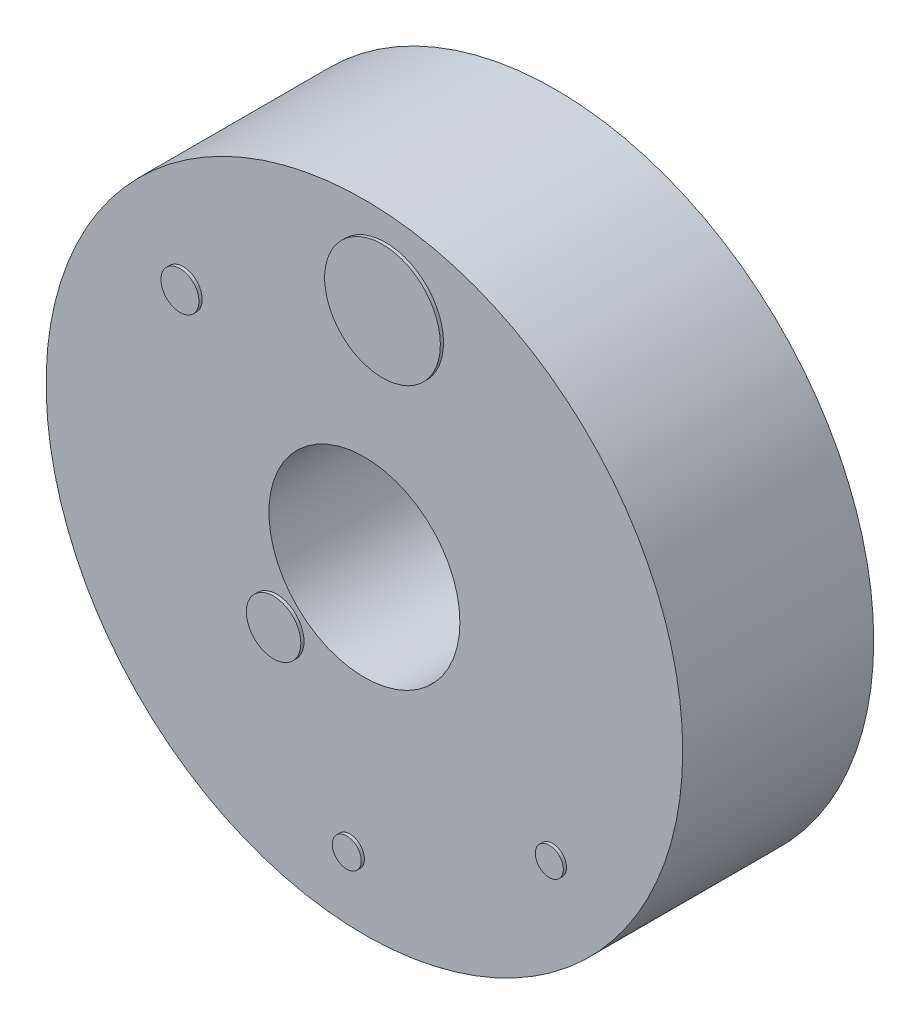
ISO-10303-21;
HEADER;
FILE_DESCRIPTION(('STEP AP214'),'2;1');
FILE_NAME('part.step','',(''),(''),'','','');
FILE_SCHEMA(('AUTOMOTIVE_DESIGN { 1 0 10303 214 1 1 1 1 }'));
ENDSEC;
DATA;
#1=APPLICATION_CONTEXT('core data for automotive mechanical design processes');
#2=APPLICATION_PROTOCOL_DEFINITION('international standard','automotive_design',2000,#1);
#3=PRODUCT_CONTEXT('',#1,'mechanical');
#4=PRODUCT('Part','Part','',(#3));
#5=PRODUCT_RELATED_PRODUCT_CATEGORY('part','',(#4));
#6=PRODUCT_DEFINITION_FORMATION('','',#4);
#7=PRODUCT_DEFINITION_CONTEXT('part definition',#1,'design');
#8=PRODUCT_DEFINITION('design','',#6,#7);
#9=PRODUCT_DEFINITION_SHAPE('','',#8);
#10=(LENGTH_UNIT() NAMED_UNIT(*) SI_UNIT(.MILLI.,.METRE.));
#11=(NAMED_UNIT(*) PLANE_ANGLE_UNIT() SI_UNIT($,.RADIAN.));
#12=(NAMED_UNIT(*) SI_UNIT($,.STERADIAN.) SOLID_ANGLE_UNIT());
#13=UNCERTAINTY_MEASURE_WITH_UNIT(LENGTH_MEASURE(1.E-05),#10,'distance_accuracy_value','');
#14=(GEOMETRIC_REPRESENTATION_CONTEXT(3) GLOBAL_UNCERTAINTY_ASSIGNED_CONTEXT((#13)) GLOBAL_UNIT_ASSIGNED_CONTEXT((#10,
#11,#12)) REPRESENTATION_CONTEXT('',''));
#15=CARTESIAN_POINT('',(0.,0.,0.));
#16=DIRECTION('',(0.,0.,1.));
#17=DIRECTION('',(1.,0.,0.));
#18=AXIS2_PLACEMENT_3D('',#15,#16,#17);
#19=CARTESIAN_POINT('',(0.,0.,6.));
#20=DIRECTION('',(0.,0.,1.));
#21=DIRECTION('',(1.,0.,0.));
#22=AXIS2_PLACEMENT_3D('',#19,#20,#21);
#23=PLANE('',#22);
#24=CARTESIAN_POINT('',(-5.69421747937929,4.73181452511803,6.));
#25=DIRECTION('',(0.,0.,1.));
#26=DIRECTION('',(1.,0.,0.));
#27=AXIS2_PLACEMENT_3D('',#24,#25,#26);
#28=CIRCLE('',#27,0.597777340965238);
#29=CARTESIAN_POINT('',(-5.09644013841406,4.73181452511803,6.));
#30=VERTEX_POINT('',#29);
#31=EDGE_CURVE('E73',#30,#30,#28,.T.);
#32=ORIENTED_EDGE('',*,*,#31,.F.);
#33=EDGE_LOOP('',(#32));
#34=FACE_BOUND('',#33,.T.);
#35=CARTESIAN_POINT('',(-0.454468061734499,-7.93982437265562,6.));
#36=DIRECTION('',(0.,0.,1.));
#37=DIRECTION('',(1.,0.,0.));
#38=AXIS2_PLACEMENT_3D('',#35,#36,#37);
#39=CIRCLE('',#38,0.454468061734499);
#40=CARTESIAN_POINT('',(0.,-7.93982437265562,6.));
#41=VERTEX_POINT('',#40);
#42=EDGE_CURVE('E67',#41,#41,#39,.T.);
#43=ORIENTED_EDGE('',*,*,#42,.F.);
#44=EDGE_LOOP('',(#43));
#45=FACE_BOUND('',#44,.T.);
#46=CARTESIAN_POINT('',(5.90808480254847,-4.99914867907945,6.));
#47=DIRECTION('',(0.,0.,1.));
#48=DIRECTION('',(1.,0.,0.));
#49=AXIS2_PLACEMENT_3D('',#46,#47,#48);
#50=CIRCLE('',#49,0.440898781647308);
#51=CARTESIAN_POINT('',(6.34898358419578,-4.99914867907945,6.));
#52=VERTEX_POINT('',#51);
#53=EDGE_CURVE('E61',#52,#52,#50,.T.);
#54=ORIENTED_EDGE('',*,*,#53,.F.);
#55=EDGE_LOOP('',(#54));
#56=FACE_BOUND('',#55,.T.);
#57=CARTESIAN_POINT('',(-2.75354178580313,-2.96740910897229,6.));
#58=DIRECTION('',(0.,0.,1.));
#59=DIRECTION('',(1.,0.,0.));
#60=AXIS2_PLACEMENT_3D('',#57,#58,#59);
#61=CIRCLE('',#60,0.855469292676707);
#62=CARTESIAN_POINT('',(-1.89807249312642,-2.96740910897229,6.));
#63=VERTEX_POINT('',#62);
#64=EDGE_CURVE('E55',#63,#63,#61,.T.);
#65=ORIENTED_EDGE('',*,*,#64,.F.);
#66=EDGE_LOOP('',(#65));
#67=FACE_BOUND('',#66,.T.);
#68=CARTESIAN_POINT('',(0.668335384903671,7.35168923394043,6.));
#69=DIRECTION('',(0.,0.,1.));
#70=DIRECTION('',(1.,0.,0.));
#71=AXIS2_PLACEMENT_3D('',#68,#69,#70);
#72=CIRCLE('',#71,1.817872246938);
#73=CARTESIAN_POINT('',(2.48620763184167,7.35168923394043,6.));
#74=VERTEX_POINT('',#73);
#75=EDGE_CURVE('E52',#74,#74,#72,.T.);
#76=ORIENTED_EDGE('',*,*,#75,.F.);
#77=EDGE_LOOP('',(#76));
#78=FACE_BOUND('',#77,.T.);
#79=CARTESIAN_POINT('',(0.,0.,6.));
#80=DIRECTION('',(0.,0.,1.));
#81=DIRECTION('',(1.,0.,0.));
#82=AXIS2_PLACEMENT_3D('',#79,#80,#81);
#83=CIRCLE('',#82,10.);
#84=CARTESIAN_POINT('',(10.,0.,6.));
#85=VERTEX_POINT('',#84);
#86=EDGE_CURVE('E10',#85,#85,#83,.T.);
#87=ORIENTED_EDGE('',*,*,#86,.T.);
#88=EDGE_LOOP('',(#87));
#89=FACE_BOUND('',#88,.T.);
#90=CARTESIAN_POINT('',(0.,0.,6.));
#91=DIRECTION('',(0.,0.,1.));
#92=DIRECTION('',(1.,0.,0.));
#93=AXIS2_PLACEMENT_3D('',#90,#91,#92);
#94=CIRCLE('',#93,3.);
#95=CARTESIAN_POINT('',(3.,0.,6.));
#96=VERTEX_POINT('',#95);
#97=EDGE_CURVE('E44',#96,#96,#94,.T.);
#98=ORIENTED_EDGE('',*,*,#97,.F.);
#99=EDGE_LOOP('',(#98));
#100=FACE_BOUND('',#99,.T.);
#101=ADVANCED_FACE('F33',(#34,#45,#56,#67,#78,#89,#100),#23,.T.);
#102=CARTESIAN_POINT('',(0.,0.,0.));
#103=DIRECTION('',(0.,0.,1.));
#104=DIRECTION('',(1.,0.,0.));
#105=AXIS2_PLACEMENT_3D('',#102,#103,#104);
#106=PLANE('',#105);
#107=CARTESIAN_POINT('',(0.,0.,0.));
#108=DIRECTION('',(0.,0.,1.));
#109=DIRECTION('',(1.,0.,0.));
#110=AXIS2_PLACEMENT_3D('',#107,#108,#109);
#111=CIRCLE('',#110,10.);
#112=CARTESIAN_POINT('',(10.,0.,0.));
#113=VERTEX_POINT('',#112);
#114=EDGE_CURVE('E37',#113,#113,#111,.T.);
#115=ORIENTED_EDGE('',*,*,#114,.F.);
#116=EDGE_LOOP('',(#115));
#117=FACE_BOUND('',#116,.T.);
#118=CARTESIAN_POINT('',(0.,0.,0.));
#119=DIRECTION('',(0.,0.,1.));
#120=DIRECTION('',(1.,0.,0.));
#121=AXIS2_PLACEMENT_3D('',#118,#119,#120);
#122=CIRCLE('',#121,3.);
#123=CARTESIAN_POINT('',(3.,0.,0.));
#124=VERTEX_POINT('',#123);
#125=EDGE_CURVE('E46',#124,#124,#122,.T.);
#126=ORIENTED_EDGE('',*,*,#125,.T.);
#127=EDGE_LOOP('',(#126));
#128=FACE_BOUND('',#127,.T.);
#129=ADVANCED_FACE('F86',(#117,#128),#106,.F.);
#130=CARTESIAN_POINT('',(0.,0.,6.));
#131=DIRECTION('',(0.,0.,-1.));
#132=DIRECTION('',(-1.,0.,0.));
#133=AXIS2_PLACEMENT_3D('',#130,#131,#132);
#134=CYLINDRICAL_SURFACE('',#133,10.);
#135=ORIENTED_EDGE('',*,*,#86,.F.);
#136=EDGE_LOOP('',(#135));
#137=FACE_BOUND('',#136,.T.);
#138=ORIENTED_EDGE('',*,*,#114,.T.);
#139=EDGE_LOOP('',(#138));
#140=FACE_BOUND('',#139,.T.);
#141=ADVANCED_FACE('F35',(#137,#140),#134,.T.);
#142=CARTESIAN_POINT('',(0.,0.,6.));
#143=DIRECTION('',(0.,0.,-1.));
#144=DIRECTION('',(-1.,0.,0.));
#145=AXIS2_PLACEMENT_3D('',#142,#143,#144);
#146=CYLINDRICAL_SURFACE('',#145,3.);
#147=ORIENTED_EDGE('',*,*,#97,.T.);
#148=EDGE_LOOP('',(#147));
#149=FACE_BOUND('',#148,.T.);
#150=ORIENTED_EDGE('',*,*,#125,.F.);
#151=EDGE_LOOP('',(#150));
#152=FACE_BOUND('',#151,.T.);
#153=ADVANCED_FACE('F98',(#149,#152),#146,.F.);
#154=CARTESIAN_POINT('',(0.668335384903671,7.35168923394043,6.1));
#155=DIRECTION('',(0.,0.,-1.));
#156=DIRECTION('',(-1.,0.,0.));
#157=AXIS2_PLACEMENT_3D('',#154,#155,#156);
#158=CYLINDRICAL_SURFACE('',#157,1.817872246938);
#159=CARTESIAN_POINT('',(0.668335384903671,7.35168923394043,6.1));
#160=DIRECTION('',(0.,0.,1.));
#161=DIRECTION('',(1.,0.,0.));
#162=AXIS2_PLACEMENT_3D('',#159,#160,#161);
#163=CIRCLE('',#162,1.817872246938);
#164=CARTESIAN_POINT('',(2.48620763184167,7.35168923394043,6.1));
#165=VERTEX_POINT('',#164);
#166=EDGE_CURVE('E49',#165,#165,#163,.T.);
#167=ORIENTED_EDGE('',*,*,#166,.F.);
#168=EDGE_LOOP('',(#167));
#169=FACE_BOUND('',#168,.T.);
#170=ORIENTED_EDGE('',*,*,#75,.T.);
#171=EDGE_LOOP('',(#170));
#172=FACE_BOUND('',#171,.T.);
#173=ADVANCED_FACE('F101',(#169,#172),#158,.T.);
#174=CARTESIAN_POINT('',(0.668335384903671,7.35168923394043,6.1));
#175=DIRECTION('',(0.,0.,1.));
#176=DIRECTION('',(1.,0.,0.));
#177=AXIS2_PLACEMENT_3D('',#174,#175,#176);
#178=PLANE('',#177);
#179=ORIENTED_EDGE('',*,*,#166,.T.);
#180=EDGE_LOOP('',(#179));
#181=FACE_BOUND('',#180,.T.);
#182=ADVANCED_FACE('F115',(#181),#178,.T.);
#183=CARTESIAN_POINT('',(-2.75354178580313,-2.96740910897229,6.1));
#184=DIRECTION('',(0.,0.,-1.));
#185=DIRECTION('',(-1.,0.,0.));
#186=AXIS2_PLACEMENT_3D('',#183,#184,#185);
#187=CYLINDRICAL_SURFACE('',#186,0.855469292676707);
#188=CARTESIAN_POINT('',(-2.75354178580313,-2.96740910897229,6.1));
#189=DIRECTION('',(0.,0.,1.));
#190=DIRECTION('',(1.,0.,0.));
#191=AXIS2_PLACEMENT_3D('',#188,#189,#190);
#192=CIRCLE('',#191,0.855469292676707);
#193=CARTESIAN_POINT('',(-1.89807249312642,-2.96740910897229,6.1));
#194=VERTEX_POINT('',#193);
#195=EDGE_CURVE('E58',#194,#194,#192,.T.);
#196=ORIENTED_EDGE('',*,*,#195,.F.);
#197=EDGE_LOOP('',(#196));
#198=FACE_BOUND('',#197,.T.);
#199=ORIENTED_EDGE('',*,*,#64,.T.);
#200=EDGE_LOOP('',(#199));
#201=FACE_BOUND('',#200,.T.);
#202=ADVANCED_FACE('F119',(#198,#201),#187,.T.);
#203=CARTESIAN_POINT('',(-2.75354178580313,-2.96740910897229,6.1));
#204=DIRECTION('',(0.,0.,1.));
#205=DIRECTION('',(1.,0.,0.));
#206=AXIS2_PLACEMENT_3D('',#203,#204,#205);
#207=PLANE('',#206);
#208=ORIENTED_EDGE('',*,*,#195,.T.);
#209=EDGE_LOOP('',(#208));
#210=FACE_BOUND('',#209,.T.);
#211=ADVANCED_FACE('F121',(#210),#207,.T.);
#212=CARTESIAN_POINT('',(5.90808480254847,-4.99914867907945,6.1));
#213=DIRECTION('',(0.,0.,-1.));
#214=DIRECTION('',(-1.,0.,0.));
#215=AXIS2_PLACEMENT_3D('',#212,#213,#214);
#216=CYLINDRICAL_SURFACE('',#215,0.440898781647308);
#217=CARTESIAN_POINT('',(5.90808480254847,-4.99914867907945,6.1));
#218=DIRECTION('',(0.,0.,1.));
#219=DIRECTION('',(1.,0.,0.));
#220=AXIS2_PLACEMENT_3D('',#217,#218,#219);
#221=CIRCLE('',#220,0.440898781647308);
#222=CARTESIAN_POINT('',(6.34898358419578,-4.99914867907945,6.1));
#223=VERTEX_POINT('',#222);
#224=EDGE_CURVE('E64',#223,#223,#221,.T.);
#225=ORIENTED_EDGE('',*,*,#224,.F.);
#226=EDGE_LOOP('',(#225));
#227=FACE_BOUND('',#226,.T.);
#228=ORIENTED_EDGE('',*,*,#53,.T.);
#229=EDGE_LOOP('',(#228));
#230=FACE_BOUND('',#229,.T.);
#231=ADVANCED_FACE('F124',(#227,#230),#216,.T.);
#232=CARTESIAN_POINT('',(5.90808480254847,-4.99914867907945,6.1));
#233=DIRECTION('',(0.,0.,1.));
#234=DIRECTION('',(1.,0.,0.));
#235=AXIS2_PLACEMENT_3D('',#232,#233,#234);
#236=PLANE('',#235);
#237=ORIENTED_EDGE('',*,*,#224,.T.);
#238=EDGE_LOOP('',(#237));
#239=FACE_BOUND('',#238,.T.);
#240=ADVANCED_FACE('F129',(#239),#236,.T.);
#241=CARTESIAN_POINT('',(-0.454468061734499,-7.93982437265562,6.1));
#242=DIRECTION('',(0.,0.,-1.));
#243=DIRECTION('',(-1.,0.,0.));
#244=AXIS2_PLACEMENT_3D('',#241,#242,#243);
#245=CYLINDRICAL_SURFACE('',#244,0.454468061734499);
#246=CARTESIAN_POINT('',(-0.454468061734499,-7.93982437265562,6.1));
#247=DIRECTION('',(0.,0.,1.));
#248=DIRECTION('',(1.,0.,0.));
#249=AXIS2_PLACEMENT_3D('',#246,#247,#248);
#250=CIRCLE('',#249,0.454468061734499);
#251=CARTESIAN_POINT('',(0.,-7.93982437265562,6.1));
#252=VERTEX_POINT('',#251);
#253=EDGE_CURVE('E70',#252,#252,#250,.T.);
#254=ORIENTED_EDGE('',*,*,#253,.F.);
#255=EDGE_LOOP('',(#254));
#256=FACE_BOUND('',#255,.T.);
#257=ORIENTED_EDGE('',*,*,#42,.T.);
#258=EDGE_LOOP('',(#257));
#259=FACE_BOUND('',#258,.T.);
#260=ADVANCED_FACE('F132',(#256,#259),#245,.T.);
#261=CARTESIAN_POINT('',(-0.454468061734499,-7.93982437265562,6.1));
#262=DIRECTION('',(0.,0.,1.));
#263=DIRECTION('',(1.,0.,0.));
#264=AXIS2_PLACEMENT_3D('',#261,#262,#263);
#265=PLANE('',#264);
#266=ORIENTED_EDGE('',*,*,#253,.T.);
#267=EDGE_LOOP('',(#266));
#268=FACE_BOUND('',#267,.T.);
#269=ADVANCED_FACE('F137',(#268),#265,.T.);
#270=CARTESIAN_POINT('',(-5.69421747937929,4.73181452511803,6.1));
#271=DIRECTION('',(0.,0.,-1.));
#272=DIRECTION('',(-1.,0.,0.));
#273=AXIS2_PLACEMENT_3D('',#270,#271,#272);
#274=CYLINDRICAL_SURFACE('',#273,0.597777340965238);
#275=CARTESIAN_POINT('',(-5.69421747937929,4.73181452511803,6.1));
#276=DIRECTION('',(0.,0.,1.));
#277=DIRECTION('',(1.,0.,0.));
#278=AXIS2_PLACEMENT_3D('',#275,#276,#277);
#279=CIRCLE('',#278,0.597777340965238);
#280=CARTESIAN_POINT('',(-5.09644013841406,4.73181452511803,6.1));
#281=VERTEX_POINT('',#280);
#282=EDGE_CURVE('E76',#281,#281,#279,.T.);
#283=ORIENTED_EDGE('',*,*,#282,.F.);
#284=EDGE_LOOP('',(#283));
#285=FACE_BOUND('',#284,.T.);
#286=ORIENTED_EDGE('',*,*,#31,.T.);
#287=EDGE_LOOP('',(#286));
#288=FACE_BOUND('',#287,.T.);
#289=ADVANCED_FACE('F82',(#285,#288),#274,.T.);
#290=CARTESIAN_POINT('',(-5.69421747937929,4.73181452511803,6.1));
#291=DIRECTION('',(0.,0.,1.));
#292=DIRECTION('',(1.,0.,0.));
#293=AXIS2_PLACEMENT_3D('',#290,#291,#292);
#294=PLANE('',#293);
#295=ORIENTED_EDGE('',*,*,#282,.T.);
#296=EDGE_LOOP('',(#295));
#297=FACE_BOUND('',#296,.T.);
#298=ADVANCED_FACE('F144',(#297),#294,.T.);
#299=CLOSED_SHELL('',(#101,#129,#141,#153,#173,#182,#202,#211,#231,#240,#260,#269,#289,#298));
#300=MANIFOLD_SOLID_BREP('B2',#299);
#301=ADVANCED_BREP_SHAPE_REPRESENTATION('',(#18,#300),#14);
#302=SHAPE_DEFINITION_REPRESENTATION(#9,#301);
ENDSEC;
END-ISO-10303-21;
